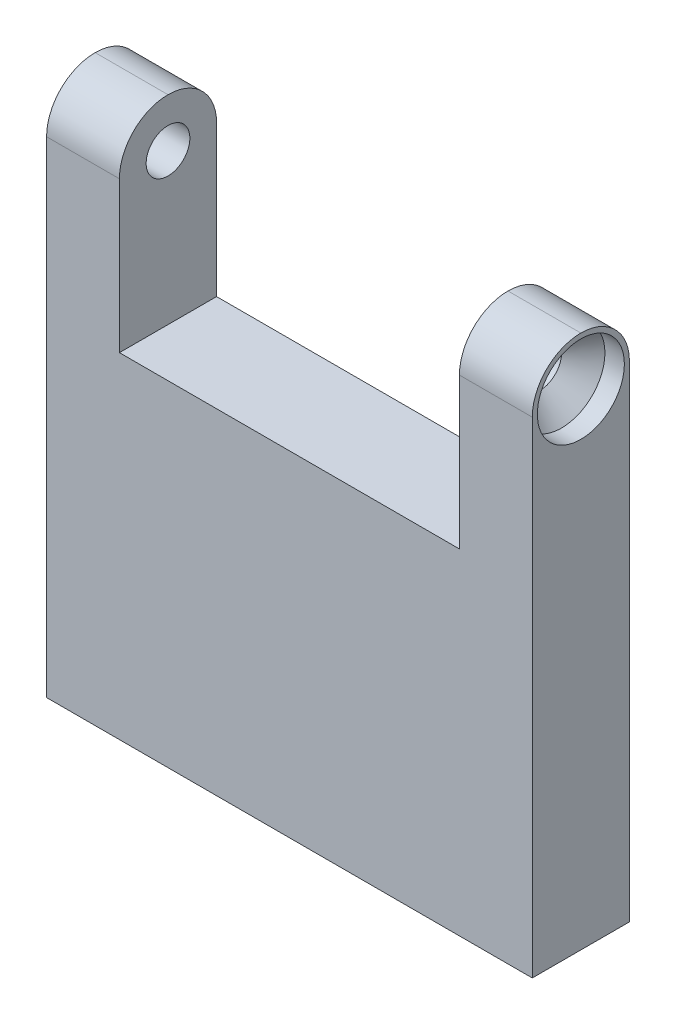
ISO-10303-21;
HEADER;
FILE_DESCRIPTION(('STEP AP214'),'2;1');
FILE_NAME('part.step','',(''),(''),'','','');
FILE_SCHEMA(('AUTOMOTIVE_DESIGN { 1 0 10303 214 1 1 1 1 }'));
ENDSEC;
DATA;
#1=APPLICATION_CONTEXT('core data for automotive mechanical design processes');
#2=APPLICATION_PROTOCOL_DEFINITION('international standard','automotive_design',2000,#1);
#3=PRODUCT_CONTEXT('',#1,'mechanical');
#4=PRODUCT('Part','Part','',(#3));
#5=PRODUCT_RELATED_PRODUCT_CATEGORY('part','',(#4));
#6=PRODUCT_DEFINITION_FORMATION('','',#4);
#7=PRODUCT_DEFINITION_CONTEXT('part definition',#1,'design');
#8=PRODUCT_DEFINITION('design','',#6,#7);
#9=PRODUCT_DEFINITION_SHAPE('','',#8);
#10=(LENGTH_UNIT() NAMED_UNIT(*) SI_UNIT(.MILLI.,.METRE.));
#11=(NAMED_UNIT(*) PLANE_ANGLE_UNIT() SI_UNIT($,.RADIAN.));
#12=(NAMED_UNIT(*) SI_UNIT($,.STERADIAN.) SOLID_ANGLE_UNIT());
#13=UNCERTAINTY_MEASURE_WITH_UNIT(LENGTH_MEASURE(1.E-05),#10,'distance_accuracy_value','');
#14=(GEOMETRIC_REPRESENTATION_CONTEXT(3) GLOBAL_UNCERTAINTY_ASSIGNED_CONTEXT((#13)) GLOBAL_UNIT_ASSIGNED_CONTEXT((#10,
#11,#12)) REPRESENTATION_CONTEXT('',''));
#15=CARTESIAN_POINT('',(0.,0.,0.));
#16=DIRECTION('',(0.,0.,1.));
#17=DIRECTION('',(1.,0.,0.));
#18=AXIS2_PLACEMENT_3D('',#15,#16,#17);
#19=CARTESIAN_POINT('',(-25.,55.,-5.));
#20=DIRECTION('',(0.,0.,1.));
#21=DIRECTION('',(1.,0.,0.));
#22=AXIS2_PLACEMENT_3D('',#19,#20,#21);
#23=PLANE('',#22);
#24=DIRECTION('',(1.,0.,0.));
#25=VECTOR('',#24,1.);
#26=CARTESIAN_POINT('',(-17.5,34.5,-5.));
#27=LINE('',#26,#25);
#28=CARTESIAN_POINT('',(-17.5,34.5,-5.));
#29=VERTEX_POINT('',#28);
#30=CARTESIAN_POINT('',(17.5,34.5,-5.));
#31=VERTEX_POINT('',#30);
#32=EDGE_CURVE('E321',#29,#31,#27,.T.);
#33=ORIENTED_EDGE('',*,*,#32,.T.);
#34=DIRECTION('',(0.,1.,0.));
#35=VECTOR('',#34,1.);
#36=CARTESIAN_POINT('',(17.5,55.,-5.));
#37=LINE('',#36,#35);
#38=CARTESIAN_POINT('',(17.5,50.,-5.));
#39=VERTEX_POINT('',#38);
#40=EDGE_CURVE('E312',#31,#39,#37,.T.);
#41=ORIENTED_EDGE('',*,*,#40,.T.);
#42=DIRECTION('',(-1.,0.,0.));
#43=VECTOR('',#42,1.);
#44=CARTESIAN_POINT('',(-25.,50.,-5.));
#45=LINE('',#44,#43);
#46=CARTESIAN_POINT('',(25.,50.,-5.));
#47=VERTEX_POINT('',#46);
#48=EDGE_CURVE('E382',#39,#47,#45,.F.);
#49=ORIENTED_EDGE('',*,*,#48,.T.);
#50=DIRECTION('',(0.,-1.,0.));
#51=VECTOR('',#50,1.);
#52=CARTESIAN_POINT('',(25.,55.,-5.));
#53=LINE('',#52,#51);
#54=CARTESIAN_POINT('',(25.,0.,-5.));
#55=VERTEX_POINT('',#54);
#56=EDGE_CURVE('E373',#47,#55,#53,.T.);
#57=ORIENTED_EDGE('',*,*,#56,.T.);
#58=DIRECTION('',(-1.,0.,0.));
#59=VECTOR('',#58,1.);
#60=CARTESIAN_POINT('',(-25.,0.,-5.));
#61=LINE('',#60,#59);
#62=CARTESIAN_POINT('',(-25.,0.,-5.));
#63=VERTEX_POINT('',#62);
#64=EDGE_CURVE('E351',#55,#63,#61,.T.);
#65=ORIENTED_EDGE('',*,*,#64,.T.);
#66=DIRECTION('',(0.,-1.,0.));
#67=VECTOR('',#66,1.);
#68=CARTESIAN_POINT('',(-25.,55.,-5.));
#69=LINE('',#68,#67);
#70=CARTESIAN_POINT('',(-25.,50.,-5.));
#71=VERTEX_POINT('',#70);
#72=EDGE_CURVE('E370',#71,#63,#69,.T.);
#73=ORIENTED_EDGE('',*,*,#72,.F.);
#74=CARTESIAN_POINT('',(-17.5,50.,-5.));
#75=VERTEX_POINT('',#74);
#76=EDGE_CURVE('E383',#71,#75,#45,.F.);
#77=ORIENTED_EDGE('',*,*,#76,.T.);
#78=DIRECTION('',(0.,-1.,0.));
#79=VECTOR('',#78,1.);
#80=CARTESIAN_POINT('',(-17.5,55.,-5.));
#81=LINE('',#80,#79);
#82=EDGE_CURVE('E316',#75,#29,#81,.T.);
#83=ORIENTED_EDGE('',*,*,#82,.T.);
#84=EDGE_LOOP('',(#33,#41,#49,#57,#65,#73,#77,#83));
#85=FACE_BOUND('',#84,.T.);
#86=DIRECTION('',(0.,1.,0.));
#87=VECTOR('',#86,1.);
#88=CARTESIAN_POINT('',(-23.7,0.,-5.));
#89=LINE('',#88,#87);
#90=CARTESIAN_POINT('',(-23.7,5.,-5.));
#91=VERTEX_POINT('',#90);
#92=CARTESIAN_POINT('',(-23.7,9.,-5.));
#93=VERTEX_POINT('',#92);
#94=EDGE_CURVE('E247',#91,#93,#89,.T.);
#95=ORIENTED_EDGE('',*,*,#94,.F.);
#96=DIRECTION('',(-1.,0.,0.));
#97=VECTOR('',#96,1.);
#98=CARTESIAN_POINT('',(0.,5.,-5.));
#99=LINE('',#98,#97);
#100=CARTESIAN_POINT('',(-16.3,5.,-5.));
#101=VERTEX_POINT('',#100);
#102=EDGE_CURVE('E67',#101,#91,#99,.T.);
#103=ORIENTED_EDGE('',*,*,#102,.F.);
#104=DIRECTION('',(0.,1.,0.));
#105=VECTOR('',#104,1.);
#106=CARTESIAN_POINT('',(-16.3,0.,-5.));
#107=LINE('',#106,#105);
#108=CARTESIAN_POINT('',(-16.3,9.,-5.));
#109=VERTEX_POINT('',#108);
#110=EDGE_CURVE('E234',#101,#109,#107,.T.);
#111=ORIENTED_EDGE('',*,*,#110,.T.);
#112=DIRECTION('',(-1.,0.,0.));
#113=VECTOR('',#112,1.);
#114=CARTESIAN_POINT('',(0.,9.,-5.));
#115=LINE('',#114,#113);
#116=EDGE_CURVE('E251',#109,#93,#115,.T.);
#117=ORIENTED_EDGE('',*,*,#116,.T.);
#118=EDGE_LOOP('',(#95,#103,#111,#117));
#119=FACE_BOUND('',#118,.T.);
#120=DIRECTION('',(1.,0.,0.));
#121=VECTOR('',#120,1.);
#122=CARTESIAN_POINT('',(0.,5.,-5.));
#123=LINE('',#122,#121);
#124=CARTESIAN_POINT('',(16.3,5.,-5.));
#125=VERTEX_POINT('',#124);
#126=CARTESIAN_POINT('',(23.7,5.,-5.));
#127=VERTEX_POINT('',#126);
#128=EDGE_CURVE('E59',#125,#127,#123,.T.);
#129=ORIENTED_EDGE('',*,*,#128,.T.);
#130=DIRECTION('',(0.,1.,0.));
#131=VECTOR('',#130,1.);
#132=CARTESIAN_POINT('',(23.7,0.,-5.));
#133=LINE('',#132,#131);
#134=CARTESIAN_POINT('',(23.7,9.,-5.));
#135=VERTEX_POINT('',#134);
#136=EDGE_CURVE('E193',#127,#135,#133,.T.);
#137=ORIENTED_EDGE('',*,*,#136,.T.);
#138=DIRECTION('',(1.,0.,0.));
#139=VECTOR('',#138,1.);
#140=CARTESIAN_POINT('',(0.,9.,-5.));
#141=LINE('',#140,#139);
#142=CARTESIAN_POINT('',(16.3,9.,-5.));
#143=VERTEX_POINT('',#142);
#144=EDGE_CURVE('E210',#143,#135,#141,.T.);
#145=ORIENTED_EDGE('',*,*,#144,.F.);
#146=DIRECTION('',(0.,1.,0.));
#147=VECTOR('',#146,1.);
#148=CARTESIAN_POINT('',(16.3,0.,-5.));
#149=LINE('',#148,#147);
#150=EDGE_CURVE('E207',#125,#143,#149,.T.);
#151=ORIENTED_EDGE('',*,*,#150,.F.);
#152=EDGE_LOOP('',(#129,#137,#145,#151));
#153=FACE_BOUND('',#152,.T.);
#154=ADVANCED_FACE('F41',(#85,#119,#153),#23,.F.);
#155=CARTESIAN_POINT('',(20.,0.,0.));
#156=DIRECTION('',(0.,-1.,0.));
#157=DIRECTION('',(0.,0.,-1.));
#158=AXIS2_PLACEMENT_3D('',#155,#156,#157);
#159=CYLINDRICAL_SURFACE('',#158,2.25);
#160=CARTESIAN_POINT('',(20.,0.,0.));
#161=DIRECTION('',(0.,-1.,0.));
#162=DIRECTION('',(0.,0.,-1.));
#163=AXIS2_PLACEMENT_3D('',#160,#161,#162);
#164=CIRCLE('',#163,2.25);
#165=CARTESIAN_POINT('',(20.,0.,-2.25));
#166=VERTEX_POINT('',#165);
#167=EDGE_CURVE('E274',#166,#166,#164,.T.);
#168=ORIENTED_EDGE('',*,*,#167,.T.);
#169=EDGE_LOOP('',(#168));
#170=FACE_BOUND('',#169,.T.);
#171=CARTESIAN_POINT('',(20.,5.,0.));
#172=DIRECTION('',(0.,1.,0.));
#173=DIRECTION('',(0.,0.,1.));
#174=AXIS2_PLACEMENT_3D('',#171,#172,#173);
#175=CIRCLE('',#174,2.25);
#176=CARTESIAN_POINT('',(20.,5.,2.25));
#177=VERTEX_POINT('',#176);
#178=EDGE_CURVE('E45',#177,#177,#175,.F.);
#179=ORIENTED_EDGE('',*,*,#178,.F.);
#180=EDGE_LOOP('',(#179));
#181=FACE_BOUND('',#180,.T.);
#182=ADVANCED_FACE('F429',(#170,#181),#159,.F.);
#183=CARTESIAN_POINT('',(-25.,55.,5.));
#184=DIRECTION('',(1.,0.,0.));
#185=DIRECTION('',(0.,0.,-1.));
#186=AXIS2_PLACEMENT_3D('',#183,#184,#185);
#187=PLANE('',#186);
#188=CARTESIAN_POINT('',(-25.,50.,0.));
#189=DIRECTION('',(1.,0.,0.));
#190=DIRECTION('',(0.,0.,-1.));
#191=AXIS2_PLACEMENT_3D('',#188,#189,#190);
#192=CIRCLE('',#191,5.);
#193=CARTESIAN_POINT('',(-25.,50.,5.));
#194=VERTEX_POINT('',#193);
#195=CARTESIAN_POINT('',(-25.,55.,0.));
#196=VERTEX_POINT('',#195);
#197=EDGE_CURVE('E376',#194,#196,#192,.F.);
#198=ORIENTED_EDGE('',*,*,#197,.T.);
#199=CARTESIAN_POINT('',(-25.,50.,0.));
#200=DIRECTION('',(1.,0.,0.));
#201=DIRECTION('',(0.,0.,-1.));
#202=AXIS2_PLACEMENT_3D('',#199,#200,#201);
#203=CIRCLE('',#202,5.);
#204=EDGE_CURVE('E379',#196,#71,#203,.F.);
#205=ORIENTED_EDGE('',*,*,#204,.T.);
#206=ORIENTED_EDGE('',*,*,#72,.T.);
#207=DIRECTION('',(0.,0.,1.));
#208=VECTOR('',#207,1.);
#209=CARTESIAN_POINT('',(-25.,0.,5.));
#210=LINE('',#209,#208);
#211=CARTESIAN_POINT('',(-25.,0.,5.));
#212=VERTEX_POINT('',#211);
#213=EDGE_CURVE('E356',#63,#212,#210,.T.);
#214=ORIENTED_EDGE('',*,*,#213,.T.);
#215=DIRECTION('',(0.,-1.,0.));
#216=VECTOR('',#215,1.);
#217=CARTESIAN_POINT('',(-25.,55.,5.));
#218=LINE('',#217,#216);
#219=EDGE_CURVE('E367',#194,#212,#218,.T.);
#220=ORIENTED_EDGE('',*,*,#219,.F.);
#221=EDGE_LOOP('',(#198,#205,#206,#214,#220));
#222=FACE_BOUND('',#221,.T.);
#223=CARTESIAN_POINT('',(-25.,50.,0.));
#224=DIRECTION('',(-1.,0.,0.));
#225=DIRECTION('',(0.,0.,1.));
#226=AXIS2_PLACEMENT_3D('',#223,#224,#225);
#227=CIRCLE('',#226,4.48);
#228=CARTESIAN_POINT('',(-25.,50.,4.48));
#229=VERTEX_POINT('',#228);
#230=EDGE_CURVE('E294',#229,#229,#227,.T.);
#231=ORIENTED_EDGE('',*,*,#230,.F.);
#232=EDGE_LOOP('',(#231));
#233=FACE_BOUND('',#232,.T.);
#234=ADVANCED_FACE('F435',(#222,#233),#187,.F.);
#235=CARTESIAN_POINT('',(0.,50.,0.));
#236=DIRECTION('',(1.,0.,0.));
#237=DIRECTION('',(0.,0.,-1.));
#238=AXIS2_PLACEMENT_3D('',#235,#236,#237);
#239=CYLINDRICAL_SURFACE('',#238,5.);
#240=CARTESIAN_POINT('',(17.5,50.,0.));
#241=DIRECTION('',(1.,0.,0.));
#242=DIRECTION('',(0.,1.,0.));
#243=AXIS2_PLACEMENT_3D('',#240,#241,#242);
#244=CIRCLE('',#243,5.);
#245=CARTESIAN_POINT('',(17.5,50.,5.));
#246=VERTEX_POINT('',#245);
#247=CARTESIAN_POINT('',(17.5,55.,0.));
#248=VERTEX_POINT('',#247);
#249=EDGE_CURVE('E343',#246,#248,#244,.F.);
#250=ORIENTED_EDGE('',*,*,#249,.F.);
#251=DIRECTION('',(1.,0.,0.));
#252=VECTOR('',#251,1.);
#253=CARTESIAN_POINT('',(-25.,50.,5.));
#254=LINE('',#253,#252);
#255=CARTESIAN_POINT('',(25.,50.,5.));
#256=VERTEX_POINT('',#255);
#257=EDGE_CURVE('E395',#256,#246,#254,.F.);
#258=ORIENTED_EDGE('',*,*,#257,.F.);
#259=CARTESIAN_POINT('',(25.,50.,0.));
#260=DIRECTION('',(-1.,0.,0.));
#261=DIRECTION('',(0.,0.,1.));
#262=AXIS2_PLACEMENT_3D('',#259,#260,#261);
#263=CIRCLE('',#262,5.);
#264=CARTESIAN_POINT('',(25.,55.,0.));
#265=VERTEX_POINT('',#264);
#266=EDGE_CURVE('E387',#265,#256,#263,.F.);
#267=ORIENTED_EDGE('',*,*,#266,.F.);
#268=DIRECTION('',(1.,0.,0.));
#269=VECTOR('',#268,1.);
#270=CARTESIAN_POINT('',(0.,55.,0.));
#271=LINE('',#270,#269);
#272=EDGE_CURVE('E346',#248,#265,#271,.T.);
#273=ORIENTED_EDGE('',*,*,#272,.F.);
#274=EDGE_LOOP('',(#250,#258,#267,#273));
#275=FACE_BOUND('',#274,.T.);
#276=ADVANCED_FACE('F459',(#275),#239,.T.);
#277=CARTESIAN_POINT('',(0.,50.,0.));
#278=DIRECTION('',(-1.,0.,0.));
#279=DIRECTION('',(0.,0.,1.));
#280=AXIS2_PLACEMENT_3D('',#277,#278,#279);
#281=CYLINDRICAL_SURFACE('',#280,5.);
#282=CARTESIAN_POINT('',(17.5,50.,0.));
#283=DIRECTION('',(1.,0.,0.));
#284=DIRECTION('',(0.,1.,0.));
#285=AXIS2_PLACEMENT_3D('',#282,#283,#284);
#286=CIRCLE('',#285,5.);
#287=EDGE_CURVE('E11',#248,#39,#286,.F.);
#288=ORIENTED_EDGE('',*,*,#287,.F.);
#289=ORIENTED_EDGE('',*,*,#272,.T.);
#290=CARTESIAN_POINT('',(25.,50.,0.));
#291=DIRECTION('',(-1.,0.,0.));
#292=DIRECTION('',(0.,0.,1.));
#293=AXIS2_PLACEMENT_3D('',#290,#291,#292);
#294=CIRCLE('',#293,5.);
#295=EDGE_CURVE('E390',#47,#265,#294,.F.);
#296=ORIENTED_EDGE('',*,*,#295,.F.);
#297=ORIENTED_EDGE('',*,*,#48,.F.);
#298=EDGE_LOOP('',(#288,#289,#296,#297));
#299=FACE_BOUND('',#298,.T.);
#300=ADVANCED_FACE('F444',(#299),#281,.T.);
#301=CARTESIAN_POINT('',(25.,55.,5.));
#302=DIRECTION('',(-1.,0.,0.));
#303=DIRECTION('',(0.,0.,1.));
#304=AXIS2_PLACEMENT_3D('',#301,#302,#303);
#305=PLANE('',#304);
#306=CARTESIAN_POINT('',(25.,50.,0.));
#307=DIRECTION('',(1.,0.,0.));
#308=DIRECTION('',(0.,0.,-1.));
#309=AXIS2_PLACEMENT_3D('',#306,#307,#308);
#310=CIRCLE('',#309,4.48);
#311=CARTESIAN_POINT('',(25.,50.,-4.48));
#312=VERTEX_POINT('',#311);
#313=EDGE_CURVE('E282',#312,#312,#310,.T.);
#314=ORIENTED_EDGE('',*,*,#313,.F.);
#315=EDGE_LOOP('',(#314));
#316=FACE_BOUND('',#315,.T.);
#317=ORIENTED_EDGE('',*,*,#56,.F.);
#318=ORIENTED_EDGE('',*,*,#295,.T.);
#319=ORIENTED_EDGE('',*,*,#266,.T.);
#320=DIRECTION('',(0.,-1.,0.));
#321=VECTOR('',#320,1.);
#322=CARTESIAN_POINT('',(25.,55.,5.));
#323=LINE('',#322,#321);
#324=CARTESIAN_POINT('',(25.,0.,5.));
#325=VERTEX_POINT('',#324);
#326=EDGE_CURVE('E364',#256,#325,#323,.T.);
#327=ORIENTED_EDGE('',*,*,#326,.T.);
#328=DIRECTION('',(0.,0.,-1.));
#329=VECTOR('',#328,1.);
#330=CARTESIAN_POINT('',(25.,0.,5.));
#331=LINE('',#330,#329);
#332=EDGE_CURVE('E347',#325,#55,#331,.T.);
#333=ORIENTED_EDGE('',*,*,#332,.T.);
#334=EDGE_LOOP('',(#317,#318,#319,#327,#333));
#335=FACE_BOUND('',#334,.T.);
#336=ADVANCED_FACE('F441',(#316,#335),#305,.F.);
#337=CARTESIAN_POINT('',(-25.,55.,5.));
#338=DIRECTION('',(0.,0.,-1.));
#339=DIRECTION('',(-1.,0.,0.));
#340=AXIS2_PLACEMENT_3D('',#337,#338,#339);
#341=PLANE('',#340);
#342=ORIENTED_EDGE('',*,*,#257,.T.);
#343=DIRECTION('',(0.,1.,0.));
#344=VECTOR('',#343,1.);
#345=CARTESIAN_POINT('',(17.5,55.,5.));
#346=LINE('',#345,#344);
#347=CARTESIAN_POINT('',(17.5,34.5,5.));
#348=VERTEX_POINT('',#347);
#349=EDGE_CURVE('E311',#348,#246,#346,.T.);
#350=ORIENTED_EDGE('',*,*,#349,.F.);
#351=DIRECTION('',(1.,0.,0.));
#352=VECTOR('',#351,1.);
#353=CARTESIAN_POINT('',(-17.5,34.5,5.));
#354=LINE('',#353,#352);
#355=CARTESIAN_POINT('',(-17.5,34.5,5.));
#356=VERTEX_POINT('',#355);
#357=EDGE_CURVE('E317',#356,#348,#354,.T.);
#358=ORIENTED_EDGE('',*,*,#357,.F.);
#359=DIRECTION('',(0.,-1.,0.));
#360=VECTOR('',#359,1.);
#361=CARTESIAN_POINT('',(-17.5,55.,5.));
#362=LINE('',#361,#360);
#363=CARTESIAN_POINT('',(-17.5,50.,5.));
#364=VERTEX_POINT('',#363);
#365=EDGE_CURVE('E328',#364,#356,#362,.T.);
#366=ORIENTED_EDGE('',*,*,#365,.F.);
#367=EDGE_CURVE('E394',#364,#194,#254,.F.);
#368=ORIENTED_EDGE('',*,*,#367,.T.);
#369=ORIENTED_EDGE('',*,*,#219,.T.);
#370=DIRECTION('',(1.,0.,0.));
#371=VECTOR('',#370,1.);
#372=CARTESIAN_POINT('',(-25.,0.,5.));
#373=LINE('',#372,#371);
#374=EDGE_CURVE('E360',#212,#325,#373,.T.);
#375=ORIENTED_EDGE('',*,*,#374,.T.);
#376=ORIENTED_EDGE('',*,*,#326,.F.);
#377=EDGE_LOOP('',(#342,#350,#358,#366,#368,#369,#375,#376));
#378=FACE_BOUND('',#377,.T.);
#379=ADVANCED_FACE('F443',(#378),#341,.F.);
#380=CARTESIAN_POINT('',(0.,0.,0.));
#381=DIRECTION('',(0.,-1.,0.));
#382=DIRECTION('',(0.,0.,-1.));
#383=AXIS2_PLACEMENT_3D('',#380,#381,#382);
#384=PLANE('',#383);
#385=ORIENTED_EDGE('',*,*,#167,.F.);
#386=EDGE_LOOP('',(#385));
#387=FACE_BOUND('',#386,.T.);
#388=CARTESIAN_POINT('',(-20.,0.,0.));
#389=DIRECTION('',(0.,-1.,0.));
#390=DIRECTION('',(0.,0.,-1.));
#391=AXIS2_PLACEMENT_3D('',#388,#389,#390);
#392=CIRCLE('',#391,2.25);
#393=CARTESIAN_POINT('',(-20.,0.,-2.25000000000001));
#394=VERTEX_POINT('',#393);
#395=EDGE_CURVE('E278',#394,#394,#392,.T.);
#396=ORIENTED_EDGE('',*,*,#395,.F.);
#397=EDGE_LOOP('',(#396));
#398=FACE_BOUND('',#397,.T.);
#399=ORIENTED_EDGE('',*,*,#332,.F.);
#400=ORIENTED_EDGE('',*,*,#374,.F.);
#401=ORIENTED_EDGE('',*,*,#213,.F.);
#402=ORIENTED_EDGE('',*,*,#64,.F.);
#403=EDGE_LOOP('',(#399,#400,#401,#402));
#404=FACE_BOUND('',#403,.T.);
#405=ADVANCED_FACE('F457',(#387,#398,#404),#384,.T.);
#406=CARTESIAN_POINT('',(-17.5,50.,0.));
#407=DIRECTION('',(-1.,0.,0.));
#408=DIRECTION('',(0.,-1.,0.));
#409=AXIS2_PLACEMENT_3D('',#406,#407,#408);
#410=CIRCLE('',#409,5.);
#411=CARTESIAN_POINT('',(-17.5,55.,0.));
#412=VERTEX_POINT('',#411);
#413=EDGE_CURVE('E337',#412,#364,#410,.F.);
#414=ORIENTED_EDGE('',*,*,#413,.F.);
#415=EDGE_CURVE('E352',#196,#412,#271,.T.);
#416=ORIENTED_EDGE('',*,*,#415,.F.);
#417=ORIENTED_EDGE('',*,*,#197,.F.);
#418=ORIENTED_EDGE('',*,*,#367,.F.);
#419=EDGE_LOOP('',(#414,#416,#417,#418));
#420=FACE_BOUND('',#419,.T.);
#421=ADVANCED_FACE('F43',(#420),#239,.T.);
#422=CARTESIAN_POINT('',(-17.5,50.,0.));
#423=DIRECTION('',(-1.,0.,0.));
#424=DIRECTION('',(0.,-1.,0.));
#425=AXIS2_PLACEMENT_3D('',#422,#423,#424);
#426=CIRCLE('',#425,5.);
#427=EDGE_CURVE('E51',#75,#412,#426,.F.);
#428=ORIENTED_EDGE('',*,*,#427,.F.);
#429=ORIENTED_EDGE('',*,*,#76,.F.);
#430=ORIENTED_EDGE('',*,*,#204,.F.);
#431=ORIENTED_EDGE('',*,*,#415,.T.);
#432=EDGE_LOOP('',(#428,#429,#430,#431));
#433=FACE_BOUND('',#432,.T.);
#434=ADVANCED_FACE('F446',(#433),#281,.T.);
#435=CARTESIAN_POINT('',(17.5,55.,-5.));
#436=DIRECTION('',(1.,0.,0.));
#437=DIRECTION('',(0.,1.,0.));
#438=AXIS2_PLACEMENT_3D('',#435,#436,#437);
#439=PLANE('',#438);
#440=CARTESIAN_POINT('',(17.5,50.,0.));
#441=DIRECTION('',(1.,0.,0.));
#442=DIRECTION('',(0.,1.,0.));
#443=AXIS2_PLACEMENT_3D('',#440,#441,#442);
#444=CIRCLE('',#443,2.24999999999999);
#445=CARTESIAN_POINT('',(17.5,52.25,0.));
#446=VERTEX_POINT('',#445);
#447=EDGE_CURVE('E307',#446,#446,#444,.T.);
#448=ORIENTED_EDGE('',*,*,#447,.T.);
#449=EDGE_LOOP('',(#448));
#450=FACE_BOUND('',#449,.T.);
#451=ORIENTED_EDGE('',*,*,#249,.T.);
#452=ORIENTED_EDGE('',*,*,#287,.T.);
#453=ORIENTED_EDGE('',*,*,#40,.F.);
#454=DIRECTION('',(0.,0.,1.));
#455=VECTOR('',#454,1.);
#456=CARTESIAN_POINT('',(17.5,34.5,-5.));
#457=LINE('',#456,#455);
#458=EDGE_CURVE('E334',#31,#348,#457,.T.);
#459=ORIENTED_EDGE('',*,*,#458,.T.);
#460=ORIENTED_EDGE('',*,*,#349,.T.);
#461=EDGE_LOOP('',(#451,#452,#453,#459,#460));
#462=FACE_BOUND('',#461,.T.);
#463=ADVANCED_FACE('F448',(#450,#462),#439,.F.);
#464=CARTESIAN_POINT('',(-17.5,34.5,-5.));
#465=DIRECTION('',(0.,-1.,0.));
#466=DIRECTION('',(0.,0.,-1.));
#467=AXIS2_PLACEMENT_3D('',#464,#465,#466);
#468=PLANE('',#467);
#469=ORIENTED_EDGE('',*,*,#357,.T.);
#470=ORIENTED_EDGE('',*,*,#458,.F.);
#471=ORIENTED_EDGE('',*,*,#32,.F.);
#472=DIRECTION('',(0.,0.,1.));
#473=VECTOR('',#472,1.);
#474=CARTESIAN_POINT('',(-17.5,34.5,-5.));
#475=LINE('',#474,#473);
#476=EDGE_CURVE('E325',#29,#356,#475,.T.);
#477=ORIENTED_EDGE('',*,*,#476,.T.);
#478=EDGE_LOOP('',(#469,#470,#471,#477));
#479=FACE_BOUND('',#478,.T.);
#480=ADVANCED_FACE('F454',(#479),#468,.F.);
#481=CARTESIAN_POINT('',(-17.5,55.,-5.));
#482=DIRECTION('',(-1.,0.,0.));
#483=DIRECTION('',(0.,-1.,0.));
#484=AXIS2_PLACEMENT_3D('',#481,#482,#483);
#485=PLANE('',#484);
#486=CARTESIAN_POINT('',(-17.5,50.,0.));
#487=DIRECTION('',(-1.,0.,0.));
#488=DIRECTION('',(0.,-1.,0.));
#489=AXIS2_PLACEMENT_3D('',#486,#487,#488);
#490=CIRCLE('',#489,2.24999999999999);
#491=CARTESIAN_POINT('',(-17.5,47.75,0.));
#492=VERTEX_POINT('',#491);
#493=EDGE_CURVE('E306',#492,#492,#490,.T.);
#494=ORIENTED_EDGE('',*,*,#493,.T.);
#495=EDGE_LOOP('',(#494));
#496=FACE_BOUND('',#495,.T.);
#497=ORIENTED_EDGE('',*,*,#413,.T.);
#498=ORIENTED_EDGE('',*,*,#365,.T.);
#499=ORIENTED_EDGE('',*,*,#476,.F.);
#500=ORIENTED_EDGE('',*,*,#82,.F.);
#501=ORIENTED_EDGE('',*,*,#427,.T.);
#502=EDGE_LOOP('',(#497,#498,#499,#500,#501));
#503=FACE_BOUND('',#502,.T.);
#504=ADVANCED_FACE('F504',(#496,#503),#485,.F.);
#505=CARTESIAN_POINT('',(-25.,50.,0.));
#506=DIRECTION('',(-1.,0.,0.));
#507=DIRECTION('',(0.,0.,1.));
#508=AXIS2_PLACEMENT_3D('',#505,#506,#507);
#509=CYLINDRICAL_SURFACE('',#508,4.48);
#510=CARTESIAN_POINT('',(-23.,50.,0.));
#511=DIRECTION('',(-1.,0.,0.));
#512=DIRECTION('',(0.,0.,1.));
#513=AXIS2_PLACEMENT_3D('',#510,#511,#512);
#514=CIRCLE('',#513,4.48);
#515=CARTESIAN_POINT('',(-23.,50.,4.48));
#516=VERTEX_POINT('',#515);
#517=EDGE_CURVE('E298',#516,#516,#514,.T.);
#518=ORIENTED_EDGE('',*,*,#517,.F.);
#519=EDGE_LOOP('',(#518));
#520=FACE_BOUND('',#519,.T.);
#521=ORIENTED_EDGE('',*,*,#230,.T.);
#522=EDGE_LOOP('',(#521));
#523=FACE_BOUND('',#522,.T.);
#524=ADVANCED_FACE('F506',(#520,#523),#509,.F.);
#525=CARTESIAN_POINT('',(-23.,50.,0.));
#526=DIRECTION('',(-1.,0.,0.));
#527=DIRECTION('',(0.,0.,1.));
#528=AXIS2_PLACEMENT_3D('',#525,#526,#527);
#529=CONICAL_SURFACE('',#528,4.48,0.785398163397447);
#530=CARTESIAN_POINT('',(-20.77,50.,0.));
#531=DIRECTION('',(-1.,0.,0.));
#532=DIRECTION('',(0.,0.,1.));
#533=AXIS2_PLACEMENT_3D('',#530,#531,#532);
#534=CIRCLE('',#533,2.25);
#535=CARTESIAN_POINT('',(-20.77,50.,2.25));
#536=VERTEX_POINT('',#535);
#537=EDGE_CURVE('E302',#536,#536,#534,.T.);
#538=ORIENTED_EDGE('',*,*,#537,.F.);
#539=EDGE_LOOP('',(#538));
#540=FACE_BOUND('',#539,.T.);
#541=ORIENTED_EDGE('',*,*,#517,.T.);
#542=EDGE_LOOP('',(#541));
#543=FACE_BOUND('',#542,.T.);
#544=ADVANCED_FACE('F513',(#540,#543),#529,.F.);
#545=CARTESIAN_POINT('',(-25.,50.,0.));
#546=DIRECTION('',(-1.,0.,0.));
#547=DIRECTION('',(0.,0.,1.));
#548=AXIS2_PLACEMENT_3D('',#545,#546,#547);
#549=CYLINDRICAL_SURFACE('',#548,2.24999999999999);
#550=ORIENTED_EDGE('',*,*,#537,.T.);
#551=EDGE_LOOP('',(#550));
#552=FACE_BOUND('',#551,.T.);
#553=ORIENTED_EDGE('',*,*,#493,.F.);
#554=EDGE_LOOP('',(#553));
#555=FACE_BOUND('',#554,.T.);
#556=ADVANCED_FACE('F580',(#552,#555),#549,.F.);
#557=CARTESIAN_POINT('',(20.77,50.,0.));
#558=DIRECTION('',(1.,0.,0.));
#559=DIRECTION('',(0.,0.,-1.));
#560=AXIS2_PLACEMENT_3D('',#557,#558,#559);
#561=CIRCLE('',#560,2.25);
#562=CARTESIAN_POINT('',(20.77,50.,-2.25));
#563=VERTEX_POINT('',#562);
#564=EDGE_CURVE('E290',#563,#563,#561,.T.);
#565=ORIENTED_EDGE('',*,*,#564,.T.);
#566=EDGE_LOOP('',(#565));
#567=FACE_BOUND('',#566,.T.);
#568=ORIENTED_EDGE('',*,*,#447,.F.);
#569=EDGE_LOOP('',(#568));
#570=FACE_BOUND('',#569,.T.);
#571=ADVANCED_FACE('F589',(#567,#570),#549,.F.);
#572=CARTESIAN_POINT('',(23.,50.,0.));
#573=DIRECTION('',(1.,0.,0.));
#574=DIRECTION('',(0.,0.,-1.));
#575=AXIS2_PLACEMENT_3D('',#572,#573,#574);
#576=CONICAL_SURFACE('',#575,4.48,0.785398163397447);
#577=ORIENTED_EDGE('',*,*,#564,.F.);
#578=EDGE_LOOP('',(#577));
#579=FACE_BOUND('',#578,.T.);
#580=CARTESIAN_POINT('',(23.,50.,0.));
#581=DIRECTION('',(1.,0.,0.));
#582=DIRECTION('',(0.,0.,-1.));
#583=AXIS2_PLACEMENT_3D('',#580,#581,#582);
#584=CIRCLE('',#583,4.48);
#585=CARTESIAN_POINT('',(23.,50.,-4.48));
#586=VERTEX_POINT('',#585);
#587=EDGE_CURVE('E286',#586,#586,#584,.T.);
#588=ORIENTED_EDGE('',*,*,#587,.T.);
#589=EDGE_LOOP('',(#588));
#590=FACE_BOUND('',#589,.T.);
#591=ADVANCED_FACE('F603',(#579,#590),#576,.F.);
#592=CARTESIAN_POINT('',(25.,50.,0.));
#593=DIRECTION('',(1.,0.,0.));
#594=DIRECTION('',(0.,0.,-1.));
#595=AXIS2_PLACEMENT_3D('',#592,#593,#594);
#596=CYLINDRICAL_SURFACE('',#595,4.48);
#597=ORIENTED_EDGE('',*,*,#587,.F.);
#598=EDGE_LOOP('',(#597));
#599=FACE_BOUND('',#598,.T.);
#600=ORIENTED_EDGE('',*,*,#313,.T.);
#601=EDGE_LOOP('',(#600));
#602=FACE_BOUND('',#601,.T.);
#603=ADVANCED_FACE('F424',(#599,#602),#596,.F.);
#604=CARTESIAN_POINT('',(-20.,0.,0.));
#605=DIRECTION('',(0.,-1.,0.));
#606=DIRECTION('',(0.,0.,-1.));
#607=AXIS2_PLACEMENT_3D('',#604,#605,#606);
#608=CYLINDRICAL_SURFACE('',#607,2.25);
#609=CARTESIAN_POINT('',(-20.,5.,0.));
#610=DIRECTION('',(0.,-1.,0.));
#611=DIRECTION('',(0.,0.,-1.));
#612=AXIS2_PLACEMENT_3D('',#609,#610,#611);
#613=CIRCLE('',#612,2.25);
#614=CARTESIAN_POINT('',(-20.,5.,-2.25000000000001));
#615=VERTEX_POINT('',#614);
#616=EDGE_CURVE('E273',#615,#615,#613,.F.);
#617=ORIENTED_EDGE('',*,*,#616,.T.);
#618=EDGE_LOOP('',(#617));
#619=FACE_BOUND('',#618,.T.);
#620=ORIENTED_EDGE('',*,*,#395,.T.);
#621=EDGE_LOOP('',(#620));
#622=FACE_BOUND('',#621,.T.);
#623=ADVANCED_FACE('F410',(#619,#622),#608,.F.);
#624=CARTESIAN_POINT('',(0.,5.,4.));
#625=DIRECTION('',(0.,-1.,0.));
#626=DIRECTION('',(0.,0.,-1.));
#627=AXIS2_PLACEMENT_3D('',#624,#625,#626);
#628=PLANE('',#627);
#629=ORIENTED_EDGE('',*,*,#102,.T.);
#630=DIRECTION('',(0.,0.,-1.));
#631=VECTOR('',#630,1.);
#632=CARTESIAN_POINT('',(-23.7,5.,4.));
#633=LINE('',#632,#631);
#634=CARTESIAN_POINT('',(-23.7,5.,4.));
#635=VERTEX_POINT('',#634);
#636=EDGE_CURVE('E244',#635,#91,#633,.T.);
#637=ORIENTED_EDGE('',*,*,#636,.F.);
#638=DIRECTION('',(-1.,0.,0.));
#639=VECTOR('',#638,1.);
#640=CARTESIAN_POINT('',(0.,5.,4.));
#641=LINE('',#640,#639);
#642=CARTESIAN_POINT('',(-16.3,5.,4.));
#643=VERTEX_POINT('',#642);
#644=EDGE_CURVE('E229',#643,#635,#641,.T.);
#645=ORIENTED_EDGE('',*,*,#644,.F.);
#646=DIRECTION('',(0.,0.,-1.));
#647=VECTOR('',#646,1.);
#648=CARTESIAN_POINT('',(-16.3,5.,4.));
#649=LINE('',#648,#647);
#650=EDGE_CURVE('E258',#643,#101,#649,.T.);
#651=ORIENTED_EDGE('',*,*,#650,.T.);
#652=EDGE_LOOP('',(#629,#637,#645,#651));
#653=FACE_BOUND('',#652,.T.);
#654=ORIENTED_EDGE('',*,*,#616,.F.);
#655=EDGE_LOOP('',(#654));
#656=FACE_BOUND('',#655,.T.);
#657=ADVANCED_FACE('F413',(#653,#656),#628,.F.);
#658=CARTESIAN_POINT('',(0.,9.,4.));
#659=DIRECTION('',(0.,-1.,0.));
#660=DIRECTION('',(0.,0.,-1.));
#661=AXIS2_PLACEMENT_3D('',#658,#659,#660);
#662=PLANE('',#661);
#663=ORIENTED_EDGE('',*,*,#116,.F.);
#664=DIRECTION('',(0.,0.,-1.));
#665=VECTOR('',#664,1.);
#666=CARTESIAN_POINT('',(-16.3,9.,4.));
#667=LINE('',#666,#665);
#668=CARTESIAN_POINT('',(-16.3,9.,4.));
#669=VERTEX_POINT('',#668);
#670=EDGE_CURVE('E262',#669,#109,#667,.T.);
#671=ORIENTED_EDGE('',*,*,#670,.F.);
#672=DIRECTION('',(-1.,0.,0.));
#673=VECTOR('',#672,1.);
#674=CARTESIAN_POINT('',(0.,9.,4.));
#675=LINE('',#674,#673);
#676=CARTESIAN_POINT('',(-23.7,9.,4.));
#677=VERTEX_POINT('',#676);
#678=EDGE_CURVE('E238',#669,#677,#675,.T.);
#679=ORIENTED_EDGE('',*,*,#678,.T.);
#680=DIRECTION('',(0.,0.,-1.));
#681=VECTOR('',#680,1.);
#682=CARTESIAN_POINT('',(-23.7,9.,4.));
#683=LINE('',#682,#681);
#684=EDGE_CURVE('E265',#677,#93,#683,.T.);
#685=ORIENTED_EDGE('',*,*,#684,.T.);
#686=EDGE_LOOP('',(#663,#671,#679,#685));
#687=FACE_BOUND('',#686,.T.);
#688=CARTESIAN_POINT('',(-20.,9.,0.));
#689=DIRECTION('',(0.,-1.,0.));
#690=DIRECTION('',(0.,0.,-1.));
#691=AXIS2_PLACEMENT_3D('',#688,#689,#690);
#692=CIRCLE('',#691,2.25);
#693=CARTESIAN_POINT('',(-20.,9.,-2.25000000000001));
#694=VERTEX_POINT('',#693);
#695=EDGE_CURVE('E261',#694,#694,#692,.F.);
#696=ORIENTED_EDGE('',*,*,#695,.T.);
#697=EDGE_LOOP('',(#696));
#698=FACE_BOUND('',#697,.T.);
#699=ADVANCED_FACE('F415',(#687,#698),#662,.T.);
#700=CARTESIAN_POINT('',(-16.3,0.,4.));
#701=DIRECTION('',(-1.,0.,0.));
#702=DIRECTION('',(0.,0.,1.));
#703=AXIS2_PLACEMENT_3D('',#700,#701,#702);
#704=PLANE('',#703);
#705=ORIENTED_EDGE('',*,*,#110,.F.);
#706=ORIENTED_EDGE('',*,*,#650,.F.);
#707=DIRECTION('',(0.,1.,0.));
#708=VECTOR('',#707,1.);
#709=CARTESIAN_POINT('',(-16.3,0.,4.));
#710=LINE('',#709,#708);
#711=EDGE_CURVE('E241',#643,#669,#710,.T.);
#712=ORIENTED_EDGE('',*,*,#711,.T.);
#713=ORIENTED_EDGE('',*,*,#670,.T.);
#714=EDGE_LOOP('',(#705,#706,#712,#713));
#715=FACE_BOUND('',#714,.T.);
#716=ADVANCED_FACE('F421',(#715),#704,.T.);
#717=CARTESIAN_POINT('',(-23.7,0.,4.));
#718=DIRECTION('',(-1.,0.,0.));
#719=DIRECTION('',(0.,0.,1.));
#720=AXIS2_PLACEMENT_3D('',#717,#718,#719);
#721=PLANE('',#720);
#722=ORIENTED_EDGE('',*,*,#94,.T.);
#723=ORIENTED_EDGE('',*,*,#684,.F.);
#724=DIRECTION('',(0.,1.,0.));
#725=VECTOR('',#724,1.);
#726=CARTESIAN_POINT('',(-23.7,0.,4.));
#727=LINE('',#726,#725);
#728=EDGE_CURVE('E233',#635,#677,#727,.T.);
#729=ORIENTED_EDGE('',*,*,#728,.F.);
#730=ORIENTED_EDGE('',*,*,#636,.T.);
#731=EDGE_LOOP('',(#722,#723,#729,#730));
#732=FACE_BOUND('',#731,.T.);
#733=ADVANCED_FACE('F652',(#732),#721,.F.);
#734=CARTESIAN_POINT('',(0.,0.,4.));
#735=DIRECTION('',(0.,0.,-1.));
#736=DIRECTION('',(-1.,0.,0.));
#737=AXIS2_PLACEMENT_3D('',#734,#735,#736);
#738=PLANE('',#737);
#739=ORIENTED_EDGE('',*,*,#644,.T.);
#740=ORIENTED_EDGE('',*,*,#728,.T.);
#741=ORIENTED_EDGE('',*,*,#678,.F.);
#742=ORIENTED_EDGE('',*,*,#711,.F.);
#743=EDGE_LOOP('',(#739,#740,#741,#742));
#744=FACE_BOUND('',#743,.T.);
#745=ADVANCED_FACE('F662',(#744),#738,.T.);
#746=CARTESIAN_POINT('',(-20.,9.,0.));
#747=DIRECTION('',(0.,-1.,0.));
#748=DIRECTION('',(0.,0.,-1.));
#749=AXIS2_PLACEMENT_3D('',#746,#747,#748);
#750=CONICAL_SURFACE('',#749,2.25,1.02974425867665);
#751=CARTESIAN_POINT('',(-20.,10.351936392812,0.));
#752=VERTEX_POINT('',#751);
#753=VERTEX_LOOP('',#752);
#754=FACE_BOUND('',#753,.T.);
#755=ORIENTED_EDGE('',*,*,#695,.F.);
#756=EDGE_LOOP('',(#755));
#757=FACE_BOUND('',#756,.T.);
#758=ADVANCED_FACE('F670',(#754,#757),#750,.F.);
#759=CARTESIAN_POINT('',(0.,5.,4.));
#760=DIRECTION('',(0.,1.,0.));
#761=DIRECTION('',(0.,0.,1.));
#762=AXIS2_PLACEMENT_3D('',#759,#760,#761);
#763=PLANE('',#762);
#764=ORIENTED_EDGE('',*,*,#128,.F.);
#765=DIRECTION('',(0.,0.,-1.));
#766=VECTOR('',#765,1.);
#767=CARTESIAN_POINT('',(16.3,5.,4.));
#768=LINE('',#767,#766);
#769=CARTESIAN_POINT('',(16.3,5.,4.));
#770=VERTEX_POINT('',#769);
#771=EDGE_CURVE('E173',#770,#125,#768,.T.);
#772=ORIENTED_EDGE('',*,*,#771,.F.);
#773=DIRECTION('',(1.,0.,0.));
#774=VECTOR('',#773,1.);
#775=CARTESIAN_POINT('',(0.,5.,4.));
#776=LINE('',#775,#774);
#777=CARTESIAN_POINT('',(23.7,5.,4.));
#778=VERTEX_POINT('',#777);
#779=EDGE_CURVE('E177',#770,#778,#776,.T.);
#780=ORIENTED_EDGE('',*,*,#779,.T.);
#781=DIRECTION('',(0.,0.,-1.));
#782=VECTOR('',#781,1.);
#783=CARTESIAN_POINT('',(23.7,5.,4.));
#784=LINE('',#783,#782);
#785=EDGE_CURVE('E217',#778,#127,#784,.T.);
#786=ORIENTED_EDGE('',*,*,#785,.T.);
#787=EDGE_LOOP('',(#764,#772,#780,#786));
#788=FACE_BOUND('',#787,.T.);
#789=ORIENTED_EDGE('',*,*,#178,.T.);
#790=EDGE_LOOP('',(#789));
#791=FACE_BOUND('',#790,.T.);
#792=ADVANCED_FACE('F175',(#788,#791),#763,.T.);
#793=CARTESIAN_POINT('',(0.,9.,4.));
#794=DIRECTION('',(0.,1.,0.));
#795=DIRECTION('',(0.,0.,1.));
#796=AXIS2_PLACEMENT_3D('',#793,#794,#795);
#797=PLANE('',#796);
#798=ORIENTED_EDGE('',*,*,#144,.T.);
#799=DIRECTION('',(0.,0.,-1.));
#800=VECTOR('',#799,1.);
#801=CARTESIAN_POINT('',(23.7,9.,4.));
#802=LINE('',#801,#800);
#803=CARTESIAN_POINT('',(23.7,9.,4.));
#804=VERTEX_POINT('',#803);
#805=EDGE_CURVE('E221',#804,#135,#802,.T.);
#806=ORIENTED_EDGE('',*,*,#805,.F.);
#807=DIRECTION('',(1.,0.,0.));
#808=VECTOR('',#807,1.);
#809=CARTESIAN_POINT('',(0.,9.,4.));
#810=LINE('',#809,#808);
#811=CARTESIAN_POINT('',(16.3,9.,4.));
#812=VERTEX_POINT('',#811);
#813=EDGE_CURVE('E198',#812,#804,#810,.T.);
#814=ORIENTED_EDGE('',*,*,#813,.F.);
#815=DIRECTION('',(0.,0.,-1.));
#816=VECTOR('',#815,1.);
#817=CARTESIAN_POINT('',(16.3,9.,4.));
#818=LINE('',#817,#816);
#819=EDGE_CURVE('E184',#812,#143,#818,.T.);
#820=ORIENTED_EDGE('',*,*,#819,.T.);
#821=EDGE_LOOP('',(#798,#806,#814,#820));
#822=FACE_BOUND('',#821,.T.);
#823=CARTESIAN_POINT('',(20.,9.,0.));
#824=DIRECTION('',(0.,1.,0.));
#825=DIRECTION('',(0.,0.,1.));
#826=AXIS2_PLACEMENT_3D('',#823,#824,#825);
#827=CIRCLE('',#826,2.25);
#828=CARTESIAN_POINT('',(20.,9.,2.25));
#829=VERTEX_POINT('',#828);
#830=EDGE_CURVE('E220',#829,#829,#827,.F.);
#831=ORIENTED_EDGE('',*,*,#830,.F.);
#832=EDGE_LOOP('',(#831));
#833=FACE_BOUND('',#832,.T.);
#834=ADVANCED_FACE('F692',(#822,#833),#797,.F.);
#835=CARTESIAN_POINT('',(23.7,0.,4.));
#836=DIRECTION('',(-1.,0.,0.));
#837=DIRECTION('',(0.,0.,1.));
#838=AXIS2_PLACEMENT_3D('',#835,#836,#837);
#839=PLANE('',#838);
#840=ORIENTED_EDGE('',*,*,#136,.F.);
#841=ORIENTED_EDGE('',*,*,#785,.F.);
#842=DIRECTION('',(0.,1.,0.));
#843=VECTOR('',#842,1.);
#844=CARTESIAN_POINT('',(23.7,0.,4.));
#845=LINE('',#844,#843);
#846=EDGE_CURVE('E185',#778,#804,#845,.T.);
#847=ORIENTED_EDGE('',*,*,#846,.T.);
#848=ORIENTED_EDGE('',*,*,#805,.T.);
#849=EDGE_LOOP('',(#840,#841,#847,#848));
#850=FACE_BOUND('',#849,.T.);
#851=ADVANCED_FACE('F701',(#850),#839,.T.);
#852=CARTESIAN_POINT('',(16.3,0.,4.));
#853=DIRECTION('',(-1.,0.,0.));
#854=DIRECTION('',(0.,0.,1.));
#855=AXIS2_PLACEMENT_3D('',#852,#853,#854);
#856=PLANE('',#855);
#857=ORIENTED_EDGE('',*,*,#150,.T.);
#858=ORIENTED_EDGE('',*,*,#819,.F.);
#859=DIRECTION('',(0.,1.,0.));
#860=VECTOR('',#859,1.);
#861=CARTESIAN_POINT('',(16.3,0.,4.));
#862=LINE('',#861,#860);
#863=EDGE_CURVE('E191',#770,#812,#862,.T.);
#864=ORIENTED_EDGE('',*,*,#863,.F.);
#865=ORIENTED_EDGE('',*,*,#771,.T.);
#866=EDGE_LOOP('',(#857,#858,#864,#865));
#867=FACE_BOUND('',#866,.T.);
#868=ADVANCED_FACE('F195',(#867),#856,.F.);
#869=CARTESIAN_POINT('',(0.,0.,4.));
#870=DIRECTION('',(0.,0.,-1.));
#871=DIRECTION('',(1.,0.,0.));
#872=AXIS2_PLACEMENT_3D('',#869,#870,#871);
#873=PLANE('',#872);
#874=ORIENTED_EDGE('',*,*,#779,.F.);
#875=ORIENTED_EDGE('',*,*,#863,.T.);
#876=ORIENTED_EDGE('',*,*,#813,.T.);
#877=ORIENTED_EDGE('',*,*,#846,.F.);
#878=EDGE_LOOP('',(#874,#875,#876,#877));
#879=FACE_BOUND('',#878,.T.);
#880=ADVANCED_FACE('F189',(#879),#873,.T.);
#881=CARTESIAN_POINT('',(20.,9.,0.));
#882=DIRECTION('',(0.,-1.,0.));
#883=DIRECTION('',(0.,0.,-1.));
#884=AXIS2_PLACEMENT_3D('',#881,#882,#883);
#885=CONICAL_SURFACE('',#884,2.25,1.02974425867665);
#886=CARTESIAN_POINT('',(20.,10.351936392812,0.));
#887=VERTEX_POINT('',#886);
#888=VERTEX_LOOP('',#887);
#889=FACE_BOUND('',#888,.T.);
#890=ORIENTED_EDGE('',*,*,#830,.T.);
#891=EDGE_LOOP('',(#890));
#892=FACE_BOUND('',#891,.T.);
#893=ADVANCED_FACE('F633',(#889,#892),#885,.F.);
#894=CLOSED_SHELL('',(#154,#182,#234,#276,#300,#336,#379,#405,#421,#434,#463,#480,#504,#524,
#544,#556,#571,#591,#603,#623,#657,#699,#716,#733,#745,#758,#792,#834,#851,#868,#880,#893));
#895=MANIFOLD_SOLID_BREP('B2',#894);
#896=ADVANCED_BREP_SHAPE_REPRESENTATION('',(#18,#895),#14);
#897=SHAPE_DEFINITION_REPRESENTATION(#9,#896);
ENDSEC;
END-ISO-10303-21;
